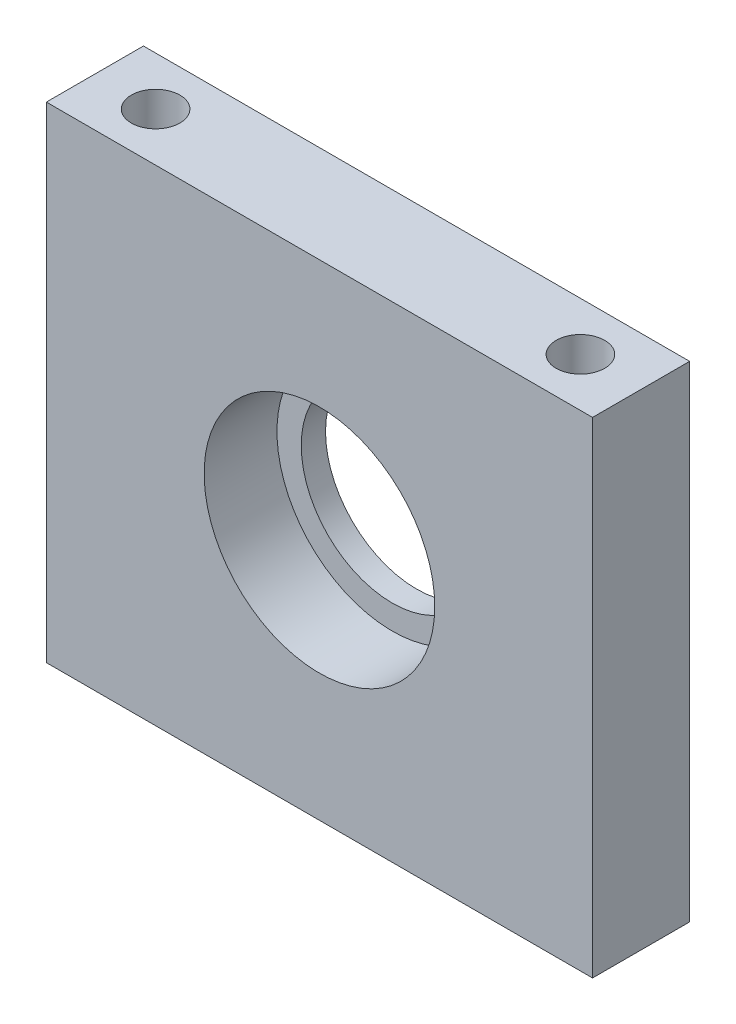
ISO-10303-21;
HEADER;
FILE_DESCRIPTION(('STEP AP214'),'2;1');
FILE_NAME('part.step','',(''),(''),'','','');
FILE_SCHEMA(('AUTOMOTIVE_DESIGN { 1 0 10303 214 1 1 1 1 }'));
ENDSEC;
DATA;
#1=APPLICATION_CONTEXT('core data for automotive mechanical design processes');
#2=APPLICATION_PROTOCOL_DEFINITION('international standard','automotive_design',2000,#1);
#3=PRODUCT_CONTEXT('',#1,'mechanical');
#4=PRODUCT('Part','Part','',(#3));
#5=PRODUCT_RELATED_PRODUCT_CATEGORY('part','',(#4));
#6=PRODUCT_DEFINITION_FORMATION('','',#4);
#7=PRODUCT_DEFINITION_CONTEXT('part definition',#1,'design');
#8=PRODUCT_DEFINITION('design','',#6,#7);
#9=PRODUCT_DEFINITION_SHAPE('','',#8);
#10=(LENGTH_UNIT() NAMED_UNIT(*) SI_UNIT(.MILLI.,.METRE.));
#11=(NAMED_UNIT(*) PLANE_ANGLE_UNIT() SI_UNIT($,.RADIAN.));
#12=(NAMED_UNIT(*) SI_UNIT($,.STERADIAN.) SOLID_ANGLE_UNIT());
#13=UNCERTAINTY_MEASURE_WITH_UNIT(LENGTH_MEASURE(1.E-05),#10,'distance_accuracy_value','');
#14=(GEOMETRIC_REPRESENTATION_CONTEXT(3) GLOBAL_UNCERTAINTY_ASSIGNED_CONTEXT((#13)) GLOBAL_UNIT_ASSIGNED_CONTEXT((#10,
#11,#12)) REPRESENTATION_CONTEXT('',''));
#15=CARTESIAN_POINT('',(0.,0.,0.));
#16=DIRECTION('',(0.,0.,1.));
#17=DIRECTION('',(1.,0.,0.));
#18=AXIS2_PLACEMENT_3D('',#15,#16,#17);
#19=CARTESIAN_POINT('',(0.,0.,0.));
#20=DIRECTION('',(0.,0.,1.));
#21=DIRECTION('',(1.,0.,0.));
#22=AXIS2_PLACEMENT_3D('',#19,#20,#21);
#23=CYLINDRICAL_SURFACE('',#22,7.5);
#24=CARTESIAN_POINT('',(0.,0.,0.));
#25=DIRECTION('',(0.,0.,1.));
#26=DIRECTION('',(1.,0.,0.));
#27=AXIS2_PLACEMENT_3D('',#24,#25,#26);
#28=CIRCLE('',#27,7.5);
#29=CARTESIAN_POINT('',(7.5,0.,0.));
#30=VERTEX_POINT('',#29);
#31=EDGE_CURVE('E104',#30,#30,#28,.T.);
#32=ORIENTED_EDGE('',*,*,#31,.F.);
#33=EDGE_LOOP('',(#32));
#34=FACE_BOUND('',#33,.T.);
#35=CARTESIAN_POINT('',(0.,0.,2.));
#36=DIRECTION('',(0.,0.,1.));
#37=DIRECTION('',(1.,0.,0.));
#38=AXIS2_PLACEMENT_3D('',#35,#36,#37);
#39=CIRCLE('',#38,7.5);
#40=CARTESIAN_POINT('',(7.5,0.,2.));
#41=VERTEX_POINT('',#40);
#42=EDGE_CURVE('E39',#41,#41,#39,.F.);
#43=ORIENTED_EDGE('',*,*,#42,.F.);
#44=EDGE_LOOP('',(#43));
#45=FACE_BOUND('',#44,.T.);
#46=ADVANCED_FACE('F35',(#34,#45),#23,.F.);
#47=CARTESIAN_POINT('',(22.5,-20.,8.));
#48=DIRECTION('',(-1.,0.,0.));
#49=DIRECTION('',(0.,0.,1.));
#50=AXIS2_PLACEMENT_3D('',#47,#48,#49);
#51=PLANE('',#50);
#52=DIRECTION('',(0.,1.,0.));
#53=VECTOR('',#52,1.);
#54=CARTESIAN_POINT('',(22.5,-20.,0.));
#55=LINE('',#54,#53);
#56=CARTESIAN_POINT('',(22.5,-20.,0.));
#57=VERTEX_POINT('',#56);
#58=CARTESIAN_POINT('',(22.5,20.,0.));
#59=VERTEX_POINT('',#58);
#60=EDGE_CURVE('E101',#57,#59,#55,.T.);
#61=ORIENTED_EDGE('',*,*,#60,.T.);
#62=DIRECTION('',(0.,0.,-1.));
#63=VECTOR('',#62,1.);
#64=CARTESIAN_POINT('',(22.5,20.,8.));
#65=LINE('',#64,#63);
#66=CARTESIAN_POINT('',(22.5,20.,8.));
#67=VERTEX_POINT('',#66);
#68=EDGE_CURVE('E11',#67,#59,#65,.T.);
#69=ORIENTED_EDGE('',*,*,#68,.F.);
#70=DIRECTION('',(0.,1.,0.));
#71=VECTOR('',#70,1.);
#72=CARTESIAN_POINT('',(22.5,-20.,8.));
#73=LINE('',#72,#71);
#74=CARTESIAN_POINT('',(22.5,-20.,8.));
#75=VERTEX_POINT('',#74);
#76=EDGE_CURVE('E88',#75,#67,#73,.T.);
#77=ORIENTED_EDGE('',*,*,#76,.F.);
#78=DIRECTION('',(0.,0.,-1.));
#79=VECTOR('',#78,1.);
#80=CARTESIAN_POINT('',(22.5,-20.,8.));
#81=LINE('',#80,#79);
#82=EDGE_CURVE('E97',#75,#57,#81,.T.);
#83=ORIENTED_EDGE('',*,*,#82,.T.);
#84=EDGE_LOOP('',(#61,#69,#77,#83));
#85=FACE_BOUND('',#84,.T.);
#86=ADVANCED_FACE('F37',(#85),#51,.F.);
#87=CARTESIAN_POINT('',(-22.5,20.,8.));
#88=DIRECTION('',(0.,-1.,0.));
#89=DIRECTION('',(0.,0.,-1.));
#90=AXIS2_PLACEMENT_3D('',#87,#88,#89);
#91=PLANE('',#90);
#92=CARTESIAN_POINT('',(-17.5,20.,4.));
#93=DIRECTION('',(0.,1.,0.));
#94=DIRECTION('',(0.,0.,1.));
#95=AXIS2_PLACEMENT_3D('',#92,#93,#94);
#96=CIRCLE('',#95,2.);
#97=CARTESIAN_POINT('',(-17.5,20.,6.));
#98=VERTEX_POINT('',#97);
#99=EDGE_CURVE('E130',#98,#98,#96,.T.);
#100=ORIENTED_EDGE('',*,*,#99,.F.);
#101=EDGE_LOOP('',(#100));
#102=FACE_BOUND('',#101,.T.);
#103=CARTESIAN_POINT('',(17.5,20.,4.));
#104=DIRECTION('',(0.,1.,0.));
#105=DIRECTION('',(0.,0.,1.));
#106=AXIS2_PLACEMENT_3D('',#103,#104,#105);
#107=CIRCLE('',#106,2.);
#108=CARTESIAN_POINT('',(17.5,20.,6.));
#109=VERTEX_POINT('',#108);
#110=EDGE_CURVE('E124',#109,#109,#107,.T.);
#111=ORIENTED_EDGE('',*,*,#110,.F.);
#112=EDGE_LOOP('',(#111));
#113=FACE_BOUND('',#112,.T.);
#114=DIRECTION('',(-1.,0.,0.));
#115=VECTOR('',#114,1.);
#116=CARTESIAN_POINT('',(-22.5,20.,0.));
#117=LINE('',#116,#115);
#118=CARTESIAN_POINT('',(-22.5,20.,0.));
#119=VERTEX_POINT('',#118);
#120=EDGE_CURVE('E92',#59,#119,#117,.T.);
#121=ORIENTED_EDGE('',*,*,#120,.T.);
#122=DIRECTION('',(0.,0.,-1.));
#123=VECTOR('',#122,1.);
#124=CARTESIAN_POINT('',(-22.5,20.,8.));
#125=LINE('',#124,#123);
#126=CARTESIAN_POINT('',(-22.5,20.,8.));
#127=VERTEX_POINT('',#126);
#128=EDGE_CURVE('E45',#127,#119,#125,.T.);
#129=ORIENTED_EDGE('',*,*,#128,.F.);
#130=DIRECTION('',(-1.,0.,0.));
#131=VECTOR('',#130,1.);
#132=CARTESIAN_POINT('',(-22.5,20.,8.));
#133=LINE('',#132,#131);
#134=EDGE_CURVE('E83',#67,#127,#133,.T.);
#135=ORIENTED_EDGE('',*,*,#134,.F.);
#136=ORIENTED_EDGE('',*,*,#68,.T.);
#137=EDGE_LOOP('',(#121,#129,#135,#136));
#138=FACE_BOUND('',#137,.T.);
#139=ADVANCED_FACE('F91',(#102,#113,#138),#91,.F.);
#140=CARTESIAN_POINT('',(-22.5,-20.,8.));
#141=DIRECTION('',(1.,0.,0.));
#142=DIRECTION('',(0.,0.,-1.));
#143=AXIS2_PLACEMENT_3D('',#140,#141,#142);
#144=PLANE('',#143);
#145=DIRECTION('',(0.,-1.,0.));
#146=VECTOR('',#145,1.);
#147=CARTESIAN_POINT('',(-22.5,-20.,0.));
#148=LINE('',#147,#146);
#149=CARTESIAN_POINT('',(-22.5,-20.,0.));
#150=VERTEX_POINT('',#149);
#151=EDGE_CURVE('E70',#119,#150,#148,.T.);
#152=ORIENTED_EDGE('',*,*,#151,.T.);
#153=DIRECTION('',(0.,0.,-1.));
#154=VECTOR('',#153,1.);
#155=CARTESIAN_POINT('',(-22.5,-20.,8.));
#156=LINE('',#155,#154);
#157=CARTESIAN_POINT('',(-22.5,-20.,8.));
#158=VERTEX_POINT('',#157);
#159=EDGE_CURVE('E93',#158,#150,#156,.T.);
#160=ORIENTED_EDGE('',*,*,#159,.F.);
#161=DIRECTION('',(0.,-1.,0.));
#162=VECTOR('',#161,1.);
#163=CARTESIAN_POINT('',(-22.5,-20.,8.));
#164=LINE('',#163,#162);
#165=EDGE_CURVE('E86',#127,#158,#164,.T.);
#166=ORIENTED_EDGE('',*,*,#165,.F.);
#167=ORIENTED_EDGE('',*,*,#128,.T.);
#168=EDGE_LOOP('',(#152,#160,#166,#167));
#169=FACE_BOUND('',#168,.T.);
#170=ADVANCED_FACE('F95',(#169),#144,.F.);
#171=CARTESIAN_POINT('',(-22.5,-20.,8.));
#172=DIRECTION('',(0.,1.,0.));
#173=DIRECTION('',(0.,0.,1.));
#174=AXIS2_PLACEMENT_3D('',#171,#172,#173);
#175=PLANE('',#174);
#176=CARTESIAN_POINT('',(-17.5,-20.,4.));
#177=DIRECTION('',(0.,1.,0.));
#178=DIRECTION('',(0.,0.,1.));
#179=AXIS2_PLACEMENT_3D('',#176,#177,#178);
#180=CIRCLE('',#179,2.);
#181=CARTESIAN_POINT('',(-17.5,-20.,6.));
#182=VERTEX_POINT('',#181);
#183=EDGE_CURVE('E121',#182,#182,#180,.T.);
#184=ORIENTED_EDGE('',*,*,#183,.T.);
#185=EDGE_LOOP('',(#184));
#186=FACE_BOUND('',#185,.T.);
#187=CARTESIAN_POINT('',(17.5,-20.,4.));
#188=DIRECTION('',(0.,1.,0.));
#189=DIRECTION('',(0.,0.,1.));
#190=AXIS2_PLACEMENT_3D('',#187,#188,#189);
#191=CIRCLE('',#190,2.);
#192=CARTESIAN_POINT('',(17.5,-20.,6.));
#193=VERTEX_POINT('',#192);
#194=EDGE_CURVE('E127',#193,#193,#191,.T.);
#195=ORIENTED_EDGE('',*,*,#194,.T.);
#196=EDGE_LOOP('',(#195));
#197=FACE_BOUND('',#196,.T.);
#198=DIRECTION('',(1.,0.,0.));
#199=VECTOR('',#198,1.);
#200=CARTESIAN_POINT('',(-22.5,-20.,0.));
#201=LINE('',#200,#199);
#202=EDGE_CURVE('E76',#150,#57,#201,.T.);
#203=ORIENTED_EDGE('',*,*,#202,.T.);
#204=ORIENTED_EDGE('',*,*,#82,.F.);
#205=DIRECTION('',(1.,0.,0.));
#206=VECTOR('',#205,1.);
#207=CARTESIAN_POINT('',(-22.5,-20.,8.));
#208=LINE('',#207,#206);
#209=EDGE_CURVE('E53',#158,#75,#208,.T.);
#210=ORIENTED_EDGE('',*,*,#209,.F.);
#211=ORIENTED_EDGE('',*,*,#159,.T.);
#212=EDGE_LOOP('',(#203,#204,#210,#211));
#213=FACE_BOUND('',#212,.T.);
#214=ADVANCED_FACE('F109',(#186,#197,#213),#175,.F.);
#215=CARTESIAN_POINT('',(0.,0.,8.));
#216=DIRECTION('',(0.,0.,-1.));
#217=DIRECTION('',(-1.,0.,0.));
#218=AXIS2_PLACEMENT_3D('',#215,#216,#217);
#219=PLANE('',#218);
#220=CARTESIAN_POINT('',(0.,0.,8.));
#221=DIRECTION('',(0.,0.,1.));
#222=DIRECTION('',(1.,0.,0.));
#223=AXIS2_PLACEMENT_3D('',#220,#221,#222);
#224=CIRCLE('',#223,9.5);
#225=CARTESIAN_POINT('',(9.5,0.,8.));
#226=VERTEX_POINT('',#225);
#227=EDGE_CURVE('E117',#226,#226,#224,.T.);
#228=ORIENTED_EDGE('',*,*,#227,.F.);
#229=EDGE_LOOP('',(#228));
#230=FACE_BOUND('',#229,.T.);
#231=ORIENTED_EDGE('',*,*,#76,.T.);
#232=ORIENTED_EDGE('',*,*,#134,.T.);
#233=ORIENTED_EDGE('',*,*,#165,.T.);
#234=ORIENTED_EDGE('',*,*,#209,.T.);
#235=EDGE_LOOP('',(#231,#232,#233,#234));
#236=FACE_BOUND('',#235,.T.);
#237=ADVANCED_FACE('F84',(#230,#236),#219,.F.);
#238=CARTESIAN_POINT('',(0.,0.,0.));
#239=DIRECTION('',(0.,0.,-1.));
#240=DIRECTION('',(-1.,0.,0.));
#241=AXIS2_PLACEMENT_3D('',#238,#239,#240);
#242=PLANE('',#241);
#243=ORIENTED_EDGE('',*,*,#31,.T.);
#244=EDGE_LOOP('',(#243));
#245=FACE_BOUND('',#244,.T.);
#246=ORIENTED_EDGE('',*,*,#60,.F.);
#247=ORIENTED_EDGE('',*,*,#202,.F.);
#248=ORIENTED_EDGE('',*,*,#151,.F.);
#249=ORIENTED_EDGE('',*,*,#120,.F.);
#250=EDGE_LOOP('',(#246,#247,#248,#249));
#251=FACE_BOUND('',#250,.T.);
#252=ADVANCED_FACE('F112',(#245,#251),#242,.T.);
#253=CARTESIAN_POINT('',(0.,0.,2.));
#254=DIRECTION('',(0.,0.,1.));
#255=DIRECTION('',(1.,0.,0.));
#256=AXIS2_PLACEMENT_3D('',#253,#254,#255);
#257=PLANE('',#256);
#258=CARTESIAN_POINT('',(0.,0.,2.));
#259=DIRECTION('',(0.,0.,1.));
#260=DIRECTION('',(1.,0.,0.));
#261=AXIS2_PLACEMENT_3D('',#258,#259,#260);
#262=CIRCLE('',#261,9.5);
#263=CARTESIAN_POINT('',(9.5,0.,2.));
#264=VERTEX_POINT('',#263);
#265=EDGE_CURVE('E120',#264,#264,#262,.T.);
#266=ORIENTED_EDGE('',*,*,#265,.T.);
#267=EDGE_LOOP('',(#266));
#268=FACE_BOUND('',#267,.T.);
#269=ORIENTED_EDGE('',*,*,#42,.T.);
#270=EDGE_LOOP('',(#269));
#271=FACE_BOUND('',#270,.T.);
#272=ADVANCED_FACE('F156',(#268,#271),#257,.T.);
#273=CARTESIAN_POINT('',(0.,0.,2.));
#274=DIRECTION('',(0.,0.,1.));
#275=DIRECTION('',(1.,0.,0.));
#276=AXIS2_PLACEMENT_3D('',#273,#274,#275);
#277=CYLINDRICAL_SURFACE('',#276,9.5);
#278=ORIENTED_EDGE('',*,*,#265,.F.);
#279=EDGE_LOOP('',(#278));
#280=FACE_BOUND('',#279,.T.);
#281=ORIENTED_EDGE('',*,*,#227,.T.);
#282=EDGE_LOOP('',(#281));
#283=FACE_BOUND('',#282,.T.);
#284=ADVANCED_FACE('F150',(#280,#283),#277,.F.);
#285=CARTESIAN_POINT('',(17.5,-20.,4.));
#286=DIRECTION('',(0.,1.,0.));
#287=DIRECTION('',(0.,0.,1.));
#288=AXIS2_PLACEMENT_3D('',#285,#286,#287);
#289=CYLINDRICAL_SURFACE('',#288,2.);
#290=ORIENTED_EDGE('',*,*,#194,.F.);
#291=EDGE_LOOP('',(#290));
#292=FACE_BOUND('',#291,.T.);
#293=ORIENTED_EDGE('',*,*,#110,.T.);
#294=EDGE_LOOP('',(#293));
#295=FACE_BOUND('',#294,.T.);
#296=ADVANCED_FACE('F141',(#292,#295),#289,.F.);
#297=CARTESIAN_POINT('',(-17.5,-20.,4.));
#298=DIRECTION('',(0.,1.,0.));
#299=DIRECTION('',(0.,0.,1.));
#300=AXIS2_PLACEMENT_3D('',#297,#298,#299);
#301=CYLINDRICAL_SURFACE('',#300,2.);
#302=ORIENTED_EDGE('',*,*,#183,.F.);
#303=EDGE_LOOP('',(#302));
#304=FACE_BOUND('',#303,.T.);
#305=ORIENTED_EDGE('',*,*,#99,.T.);
#306=EDGE_LOOP('',(#305));
#307=FACE_BOUND('',#306,.T.);
#308=ADVANCED_FACE('F138',(#304,#307),#301,.F.);
#309=CLOSED_SHELL('',(#46,#86,#139,#170,#214,#237,#252,#272,#284,#296,#308));
#310=MANIFOLD_SOLID_BREP('B2',#309);
#311=ADVANCED_BREP_SHAPE_REPRESENTATION('',(#18,#310),#14);
#312=SHAPE_DEFINITION_REPRESENTATION(#9,#311);
ENDSEC;
END-ISO-10303-21;
